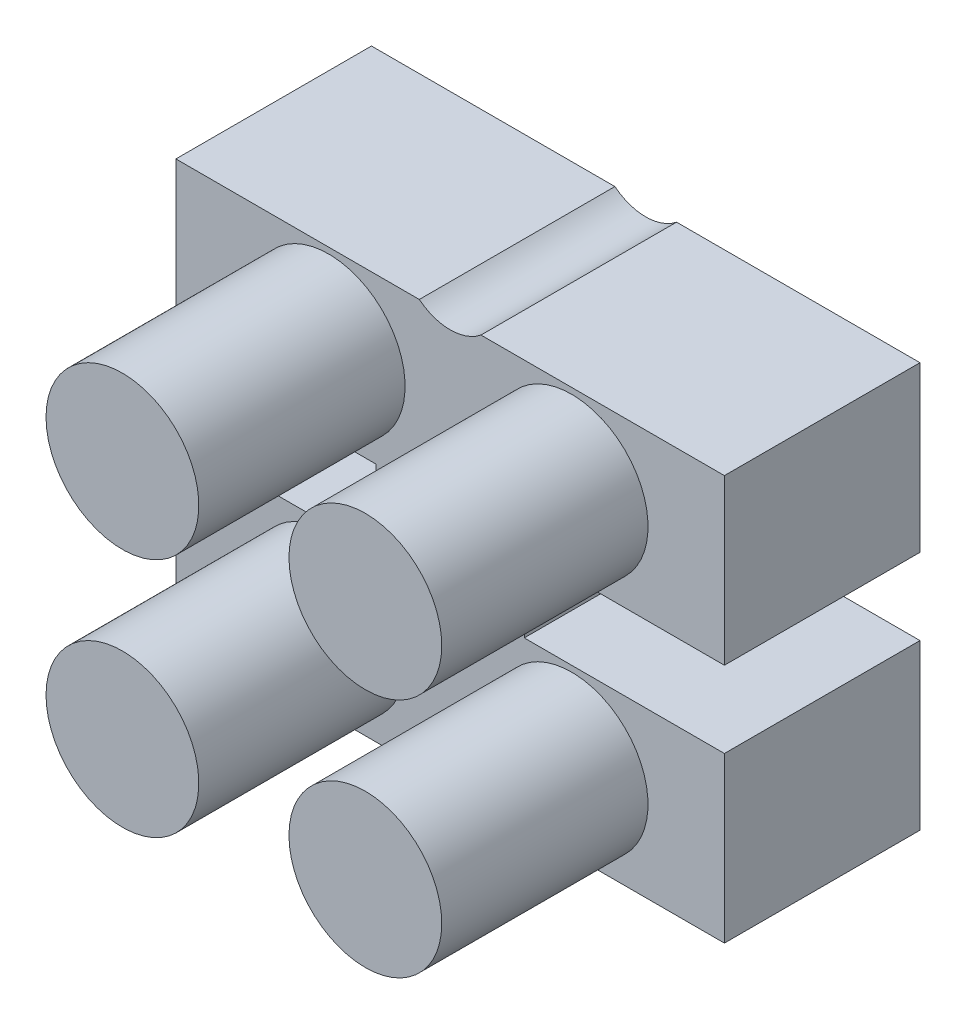
ISO-10303-21;
HEADER;
FILE_DESCRIPTION(('STEP AP214'),'2;1');
FILE_NAME('part.step','',(''),(''),'','','');
FILE_SCHEMA(('AUTOMOTIVE_DESIGN { 1 0 10303 214 1 1 1 1 }'));
ENDSEC;
DATA;
#1=APPLICATION_CONTEXT('core data for automotive mechanical design processes');
#2=APPLICATION_PROTOCOL_DEFINITION('international standard','automotive_design',2000,#1);
#3=PRODUCT_CONTEXT('',#1,'mechanical');
#4=PRODUCT('Part','Part','',(#3));
#5=PRODUCT_RELATED_PRODUCT_CATEGORY('part','',(#4));
#6=PRODUCT_DEFINITION_FORMATION('','',#4);
#7=PRODUCT_DEFINITION_CONTEXT('part definition',#1,'design');
#8=PRODUCT_DEFINITION('design','',#6,#7);
#9=PRODUCT_DEFINITION_SHAPE('','',#8);
#10=(LENGTH_UNIT() NAMED_UNIT(*) SI_UNIT(.MILLI.,.METRE.));
#11=(NAMED_UNIT(*) PLANE_ANGLE_UNIT() SI_UNIT($,.RADIAN.));
#12=(NAMED_UNIT(*) SI_UNIT($,.STERADIAN.) SOLID_ANGLE_UNIT());
#13=UNCERTAINTY_MEASURE_WITH_UNIT(LENGTH_MEASURE(1.E-05),#10,'distance_accuracy_value','');
#14=(GEOMETRIC_REPRESENTATION_CONTEXT(3) GLOBAL_UNCERTAINTY_ASSIGNED_CONTEXT((#13)) GLOBAL_UNIT_ASSIGNED_CONTEXT((#10,
#11,#12)) REPRESENTATION_CONTEXT('',''));
#15=CARTESIAN_POINT('',(0.,0.,0.));
#16=DIRECTION('',(0.,0.,1.));
#17=DIRECTION('',(1.,0.,0.));
#18=AXIS2_PLACEMENT_3D('',#15,#16,#17);
#19=CARTESIAN_POINT('',(0.,0.,6.5024));
#20=DIRECTION('',(0.,0.,-1.));
#21=DIRECTION('',(-1.,0.,0.));
#22=AXIS2_PLACEMENT_3D('',#19,#20,#21);
#23=PLANE('',#22);
#24=CARTESIAN_POINT('',(-4.0386,11.99515,6.5024));
#25=DIRECTION('',(0.,0.,-1.));
#26=DIRECTION('',(-1.,0.,0.));
#27=AXIS2_PLACEMENT_3D('',#24,#25,#26);
#28=CIRCLE('',#27,2.54);
#29=CARTESIAN_POINT('',(-6.5786,11.99515,6.5024));
#30=VERTEX_POINT('',#29);
#31=EDGE_CURVE('E269',#30,#30,#28,.T.);
#32=ORIENTED_EDGE('',*,*,#31,.T.);
#33=EDGE_LOOP('',(#32));
#34=FACE_BOUND('',#33,.T.);
#35=CARTESIAN_POINT('',(0.,16.002,6.5024));
#36=DIRECTION('',(0.,0.,1.));
#37=DIRECTION('',(1.,0.,0.));
#38=AXIS2_PLACEMENT_3D('',#35,#36,#37);
#39=CIRCLE('',#38,1.63194999999999);
#40=CARTESIAN_POINT('',(1.63194999999999,16.002,6.5024));
#41=VERTEX_POINT('',#40);
#42=EDGE_CURVE('E306',#41,#41,#39,.T.);
#43=ORIENTED_EDGE('',*,*,#42,.F.);
#44=EDGE_LOOP('',(#43));
#45=FACE_BOUND('',#44,.T.);
#46=CARTESIAN_POINT('',(4.0386,19.99615,6.5024));
#47=DIRECTION('',(0.,0.,-1.));
#48=DIRECTION('',(-1.,0.,0.));
#49=AXIS2_PLACEMENT_3D('',#46,#47,#48);
#50=CIRCLE('',#49,2.54);
#51=CARTESIAN_POINT('',(1.49859999999999,19.99615,6.5024));
#52=VERTEX_POINT('',#51);
#53=EDGE_CURVE('E11',#52,#52,#50,.F.);
#54=ORIENTED_EDGE('',*,*,#53,.F.);
#55=EDGE_LOOP('',(#54));
#56=FACE_BOUND('',#55,.T.);
#57=CARTESIAN_POINT('',(4.0386,11.99515,6.5024));
#58=DIRECTION('',(0.,0.,-1.));
#59=DIRECTION('',(-1.,0.,0.));
#60=AXIS2_PLACEMENT_3D('',#57,#58,#59);
#61=CIRCLE('',#60,2.54);
#62=CARTESIAN_POINT('',(1.49859999999999,11.99515,6.5024));
#63=VERTEX_POINT('',#62);
#64=EDGE_CURVE('E42',#63,#63,#61,.F.);
#65=ORIENTED_EDGE('',*,*,#64,.F.);
#66=EDGE_LOOP('',(#65));
#67=FACE_BOUND('',#66,.T.);
#68=CARTESIAN_POINT('',(-4.0386,19.99615,6.5024));
#69=DIRECTION('',(0.,0.,-1.));
#70=DIRECTION('',(-1.,0.,0.));
#71=AXIS2_PLACEMENT_3D('',#68,#69,#70);
#72=CIRCLE('',#71,2.54);
#73=CARTESIAN_POINT('',(-6.5786,19.99615,6.5024));
#74=VERTEX_POINT('',#73);
#75=EDGE_CURVE('E238',#74,#74,#72,.T.);
#76=ORIENTED_EDGE('',*,*,#75,.T.);
#77=EDGE_LOOP('',(#76));
#78=FACE_BOUND('',#77,.T.);
#79=CARTESIAN_POINT('',(0.,8.001,6.5024));
#80=DIRECTION('',(0.,0.,1.));
#81=DIRECTION('',(1.,0.,0.));
#82=AXIS2_PLACEMENT_3D('',#79,#80,#81);
#83=CIRCLE('',#82,1.63194999999999);
#84=CARTESIAN_POINT('',(1.02487111506763,9.271,6.5024));
#85=VERTEX_POINT('',#84);
#86=CARTESIAN_POINT('',(-1.02487111506763,9.271,6.5024));
#87=VERTEX_POINT('',#86);
#88=EDGE_CURVE('E171',#85,#87,#83,.T.);
#89=ORIENTED_EDGE('',*,*,#88,.F.);
#90=DIRECTION('',(-1.,0.,0.));
#91=VECTOR('',#90,1.);
#92=CARTESIAN_POINT('',(9.1186,9.271,6.5024));
#93=LINE('',#92,#91);
#94=CARTESIAN_POINT('',(9.1186,9.271,6.5024));
#95=VERTEX_POINT('',#94);
#96=EDGE_CURVE('E49',#95,#85,#93,.T.);
#97=ORIENTED_EDGE('',*,*,#96,.F.);
#98=DIRECTION('',(0.,1.,0.));
#99=VECTOR('',#98,1.);
#100=CARTESIAN_POINT('',(9.1186,1.2573,6.5024));
#101=LINE('',#100,#99);
#102=CARTESIAN_POINT('',(9.1186,14.732,6.5024));
#103=VERTEX_POINT('',#102);
#104=EDGE_CURVE('E219',#95,#103,#101,.T.);
#105=ORIENTED_EDGE('',*,*,#104,.T.);
#106=DIRECTION('',(1.,0.,0.));
#107=VECTOR('',#106,1.);
#108=CARTESIAN_POINT('',(9.1186,14.732,6.5024));
#109=LINE('',#108,#107);
#110=CARTESIAN_POINT('',(2.4638,14.732,6.5024));
#111=VERTEX_POINT('',#110);
#112=EDGE_CURVE('E193',#111,#103,#109,.T.);
#113=ORIENTED_EDGE('',*,*,#112,.F.);
#114=DIRECTION('',(0.,-1.,0.));
#115=VECTOR('',#114,1.);
#116=CARTESIAN_POINT('',(2.4638,17.272,6.5024));
#117=LINE('',#116,#115);
#118=CARTESIAN_POINT('',(2.4638,17.272,6.5024));
#119=VERTEX_POINT('',#118);
#120=EDGE_CURVE('E201',#119,#111,#117,.T.);
#121=ORIENTED_EDGE('',*,*,#120,.F.);
#122=DIRECTION('',(-1.,0.,0.));
#123=VECTOR('',#122,1.);
#124=CARTESIAN_POINT('',(9.1186,17.272,6.5024));
#125=LINE('',#124,#123);
#126=CARTESIAN_POINT('',(9.1186,17.272,6.5024));
#127=VERTEX_POINT('',#126);
#128=EDGE_CURVE('E188',#127,#119,#125,.T.);
#129=ORIENTED_EDGE('',*,*,#128,.F.);
#130=CARTESIAN_POINT('',(9.1186,22.733,6.5024));
#131=VERTEX_POINT('',#130);
#132=EDGE_CURVE('E216',#127,#131,#101,.T.);
#133=ORIENTED_EDGE('',*,*,#132,.T.);
#134=DIRECTION('',(1.,0.,0.));
#135=VECTOR('',#134,1.);
#136=CARTESIAN_POINT('',(9.1186,22.733,6.5024));
#137=LINE('',#136,#135);
#138=CARTESIAN_POINT('',(1.02487111506764,22.733,6.5024));
#139=VERTEX_POINT('',#138);
#140=EDGE_CURVE('E182',#139,#131,#137,.T.);
#141=ORIENTED_EDGE('',*,*,#140,.F.);
#142=CARTESIAN_POINT('',(0.,24.003,6.5024));
#143=DIRECTION('',(0.,0.,1.));
#144=DIRECTION('',(1.,0.,0.));
#145=AXIS2_PLACEMENT_3D('',#142,#143,#144);
#146=CIRCLE('',#145,1.63194999999999);
#147=CARTESIAN_POINT('',(-1.02487111506764,22.733,6.5024));
#148=VERTEX_POINT('',#147);
#149=EDGE_CURVE('E300',#148,#139,#146,.T.);
#150=ORIENTED_EDGE('',*,*,#149,.F.);
#151=DIRECTION('',(-1.,0.,0.));
#152=VECTOR('',#151,1.);
#153=CARTESIAN_POINT('',(-9.1186,22.733,6.5024));
#154=LINE('',#153,#152);
#155=CARTESIAN_POINT('',(-9.1186,22.733,6.5024));
#156=VERTEX_POINT('',#155);
#157=EDGE_CURVE('E261',#148,#156,#154,.T.);
#158=ORIENTED_EDGE('',*,*,#157,.T.);
#159=DIRECTION('',(0.,-1.,0.));
#160=VECTOR('',#159,1.);
#161=CARTESIAN_POINT('',(-9.1186,1.2573,6.5024));
#162=LINE('',#161,#160);
#163=CARTESIAN_POINT('',(-9.1186,17.272,6.5024));
#164=VERTEX_POINT('',#163);
#165=EDGE_CURVE('E221',#156,#164,#162,.T.);
#166=ORIENTED_EDGE('',*,*,#165,.T.);
#167=DIRECTION('',(1.,0.,0.));
#168=VECTOR('',#167,1.);
#169=CARTESIAN_POINT('',(-9.1186,17.272,6.5024));
#170=LINE('',#169,#168);
#171=CARTESIAN_POINT('',(-2.4638,17.272,6.5024));
#172=VERTEX_POINT('',#171);
#173=EDGE_CURVE('E279',#164,#172,#170,.T.);
#174=ORIENTED_EDGE('',*,*,#173,.T.);
#175=DIRECTION('',(0.,-1.,0.));
#176=VECTOR('',#175,1.);
#177=CARTESIAN_POINT('',(-2.4638,17.272,6.5024));
#178=LINE('',#177,#176);
#179=CARTESIAN_POINT('',(-2.4638,14.732,6.5024));
#180=VERTEX_POINT('',#179);
#181=EDGE_CURVE('E285',#172,#180,#178,.T.);
#182=ORIENTED_EDGE('',*,*,#181,.T.);
#183=DIRECTION('',(-1.,0.,0.));
#184=VECTOR('',#183,1.);
#185=CARTESIAN_POINT('',(-9.1186,14.732,6.5024));
#186=LINE('',#185,#184);
#187=CARTESIAN_POINT('',(-9.1186,14.732,6.5024));
#188=VERTEX_POINT('',#187);
#189=EDGE_CURVE('E273',#180,#188,#186,.T.);
#190=ORIENTED_EDGE('',*,*,#189,.T.);
#191=CARTESIAN_POINT('',(-9.1186,9.271,6.5024));
#192=VERTEX_POINT('',#191);
#193=EDGE_CURVE('E223',#188,#192,#162,.T.);
#194=ORIENTED_EDGE('',*,*,#193,.T.);
#195=DIRECTION('',(1.,0.,0.));
#196=VECTOR('',#195,1.);
#197=CARTESIAN_POINT('',(-9.1186,9.271,6.5024));
#198=LINE('',#197,#196);
#199=EDGE_CURVE('E242',#192,#87,#198,.T.);
#200=ORIENTED_EDGE('',*,*,#199,.T.);
#201=EDGE_LOOP('',(#89,#97,#105,#113,#121,#129,#133,#141,#150,#158,#166,#174,#182,#190,#194,#200));
#202=FACE_BOUND('',#201,.T.);
#203=ADVANCED_FACE('F34',(#34,#45,#56,#67,#78,#202),#23,.F.);
#204=CARTESIAN_POINT('',(0.,0.,0.));
#205=DIRECTION('',(0.,0.,-1.));
#206=DIRECTION('',(-1.,0.,0.));
#207=AXIS2_PLACEMENT_3D('',#204,#205,#206);
#208=PLANE('',#207);
#209=CARTESIAN_POINT('',(0.,16.002,0.));
#210=DIRECTION('',(0.,0.,1.));
#211=DIRECTION('',(1.,0.,0.));
#212=AXIS2_PLACEMENT_3D('',#209,#210,#211);
#213=CIRCLE('',#212,1.63195);
#214=CARTESIAN_POINT('',(1.63195,16.002,0.));
#215=VERTEX_POINT('',#214);
#216=EDGE_CURVE('E176',#215,#215,#213,.T.);
#217=ORIENTED_EDGE('',*,*,#216,.T.);
#218=EDGE_LOOP('',(#217));
#219=FACE_BOUND('',#218,.T.);
#220=DIRECTION('',(-1.,0.,0.));
#221=VECTOR('',#220,1.);
#222=CARTESIAN_POINT('',(9.1186,9.271,0.));
#223=LINE('',#222,#221);
#224=CARTESIAN_POINT('',(9.1186,9.271,0.));
#225=VERTEX_POINT('',#224);
#226=CARTESIAN_POINT('',(1.02487111506763,9.271,0.));
#227=VERTEX_POINT('',#226);
#228=EDGE_CURVE('E149',#225,#227,#223,.T.);
#229=ORIENTED_EDGE('',*,*,#228,.T.);
#230=CARTESIAN_POINT('',(0.,8.001,0.));
#231=DIRECTION('',(0.,0.,1.));
#232=DIRECTION('',(1.,0.,0.));
#233=AXIS2_PLACEMENT_3D('',#230,#231,#232);
#234=CIRCLE('',#233,1.63195);
#235=CARTESIAN_POINT('',(-1.02487111506763,9.271,0.));
#236=VERTEX_POINT('',#235);
#237=EDGE_CURVE('E152',#227,#236,#234,.T.);
#238=ORIENTED_EDGE('',*,*,#237,.T.);
#239=DIRECTION('',(1.,0.,0.));
#240=VECTOR('',#239,1.);
#241=CARTESIAN_POINT('',(-9.1186,9.271,0.));
#242=LINE('',#241,#240);
#243=CARTESIAN_POINT('',(-9.1186,9.271,0.));
#244=VERTEX_POINT('',#243);
#245=EDGE_CURVE('E248',#244,#236,#242,.T.);
#246=ORIENTED_EDGE('',*,*,#245,.F.);
#247=DIRECTION('',(0.,-1.,0.));
#248=VECTOR('',#247,1.);
#249=CARTESIAN_POINT('',(-9.1186,1.2573,0.));
#250=LINE('',#249,#248);
#251=CARTESIAN_POINT('',(-9.1186,14.732,0.));
#252=VERTEX_POINT('',#251);
#253=EDGE_CURVE('E226',#252,#244,#250,.T.);
#254=ORIENTED_EDGE('',*,*,#253,.F.);
#255=DIRECTION('',(-1.,0.,0.));
#256=VECTOR('',#255,1.);
#257=CARTESIAN_POINT('',(-9.1186,14.732,0.));
#258=LINE('',#257,#256);
#259=CARTESIAN_POINT('',(-2.4638,14.732,0.));
#260=VERTEX_POINT('',#259);
#261=EDGE_CURVE('E276',#260,#252,#258,.T.);
#262=ORIENTED_EDGE('',*,*,#261,.F.);
#263=DIRECTION('',(0.,-1.,0.));
#264=VECTOR('',#263,1.);
#265=CARTESIAN_POINT('',(-2.4638,17.272,0.));
#266=LINE('',#265,#264);
#267=CARTESIAN_POINT('',(-2.4638,17.272,0.));
#268=VERTEX_POINT('',#267);
#269=EDGE_CURVE('E278',#268,#260,#266,.T.);
#270=ORIENTED_EDGE('',*,*,#269,.F.);
#271=DIRECTION('',(1.,0.,0.));
#272=VECTOR('',#271,1.);
#273=CARTESIAN_POINT('',(-9.1186,17.272,0.));
#274=LINE('',#273,#272);
#275=CARTESIAN_POINT('',(-9.1186,17.272,0.));
#276=VERTEX_POINT('',#275);
#277=EDGE_CURVE('E281',#276,#268,#274,.T.);
#278=ORIENTED_EDGE('',*,*,#277,.F.);
#279=CARTESIAN_POINT('',(-9.1186,22.733,0.));
#280=VERTEX_POINT('',#279);
#281=EDGE_CURVE('E220',#280,#276,#250,.T.);
#282=ORIENTED_EDGE('',*,*,#281,.F.);
#283=DIRECTION('',(-1.,0.,0.));
#284=VECTOR('',#283,1.);
#285=CARTESIAN_POINT('',(-9.1186,22.733,0.));
#286=LINE('',#285,#284);
#287=CARTESIAN_POINT('',(-1.02487111506764,22.733,0.));
#288=VERTEX_POINT('',#287);
#289=EDGE_CURVE('E263',#288,#280,#286,.T.);
#290=ORIENTED_EDGE('',*,*,#289,.F.);
#291=CARTESIAN_POINT('',(0.,24.003,0.));
#292=DIRECTION('',(0.,0.,1.));
#293=DIRECTION('',(1.,0.,0.));
#294=AXIS2_PLACEMENT_3D('',#291,#292,#293);
#295=CIRCLE('',#294,1.63195);
#296=CARTESIAN_POINT('',(1.02487111506764,22.733,0.));
#297=VERTEX_POINT('',#296);
#298=EDGE_CURVE('E303',#288,#297,#295,.T.);
#299=ORIENTED_EDGE('',*,*,#298,.T.);
#300=DIRECTION('',(1.,0.,0.));
#301=VECTOR('',#300,1.);
#302=CARTESIAN_POINT('',(9.1186,22.733,0.));
#303=LINE('',#302,#301);
#304=CARTESIAN_POINT('',(9.1186,22.733,0.));
#305=VERTEX_POINT('',#304);
#306=EDGE_CURVE('E57',#297,#305,#303,.T.);
#307=ORIENTED_EDGE('',*,*,#306,.T.);
#308=DIRECTION('',(0.,1.,0.));
#309=VECTOR('',#308,1.);
#310=CARTESIAN_POINT('',(9.1186,1.2573,0.));
#311=LINE('',#310,#309);
#312=CARTESIAN_POINT('',(9.1186,17.272,0.));
#313=VERTEX_POINT('',#312);
#314=EDGE_CURVE('E215',#313,#305,#311,.T.);
#315=ORIENTED_EDGE('',*,*,#314,.F.);
#316=DIRECTION('',(-1.,0.,0.));
#317=VECTOR('',#316,1.);
#318=CARTESIAN_POINT('',(9.1186,17.272,0.));
#319=LINE('',#318,#317);
#320=CARTESIAN_POINT('',(2.4638,17.272,0.));
#321=VERTEX_POINT('',#320);
#322=EDGE_CURVE('E189',#313,#321,#319,.T.);
#323=ORIENTED_EDGE('',*,*,#322,.T.);
#324=DIRECTION('',(0.,-1.,0.));
#325=VECTOR('',#324,1.);
#326=CARTESIAN_POINT('',(2.4638,17.272,0.));
#327=LINE('',#326,#325);
#328=CARTESIAN_POINT('',(2.4638,14.732,0.));
#329=VERTEX_POINT('',#328);
#330=EDGE_CURVE('E192',#321,#329,#327,.T.);
#331=ORIENTED_EDGE('',*,*,#330,.T.);
#332=DIRECTION('',(1.,0.,0.));
#333=VECTOR('',#332,1.);
#334=CARTESIAN_POINT('',(9.1186,14.732,0.));
#335=LINE('',#334,#333);
#336=CARTESIAN_POINT('',(9.1186,14.732,0.));
#337=VERTEX_POINT('',#336);
#338=EDGE_CURVE('E196',#329,#337,#335,.T.);
#339=ORIENTED_EDGE('',*,*,#338,.T.);
#340=EDGE_CURVE('E155',#225,#337,#311,.T.);
#341=ORIENTED_EDGE('',*,*,#340,.F.);
#342=EDGE_LOOP('',(#229,#238,#246,#254,#262,#270,#278,#282,#290,#299,#307,#315,#323,#331,#339,#341));
#343=FACE_BOUND('',#342,.T.);
#344=ADVANCED_FACE('F36',(#219,#343),#208,.T.);
#345=CARTESIAN_POINT('',(0.,8.001,6.5024));
#346=DIRECTION('',(0.,0.,1.));
#347=DIRECTION('',(1.,0.,0.));
#348=AXIS2_PLACEMENT_3D('',#345,#346,#347);
#349=CYLINDRICAL_SURFACE('',#348,1.63194999999999);
#350=DIRECTION('',(0.,0.,1.));
#351=VECTOR('',#350,1.);
#352=CARTESIAN_POINT('',(1.02487111506763,9.271,6.5024));
#353=LINE('',#352,#351);
#354=EDGE_CURVE('E159',#85,#227,#353,.F.);
#355=ORIENTED_EDGE('',*,*,#354,.F.);
#356=ORIENTED_EDGE('',*,*,#88,.T.);
#357=DIRECTION('',(0.,0.,1.));
#358=VECTOR('',#357,1.);
#359=CARTESIAN_POINT('',(-1.02487111506763,9.271,6.5024));
#360=LINE('',#359,#358);
#361=EDGE_CURVE('E165',#236,#87,#360,.T.);
#362=ORIENTED_EDGE('',*,*,#361,.F.);
#363=ORIENTED_EDGE('',*,*,#237,.F.);
#364=EDGE_LOOP('',(#355,#356,#362,#363));
#365=FACE_BOUND('',#364,.T.);
#366=ADVANCED_FACE('F168',(#365),#349,.F.);
#367=CARTESIAN_POINT('',(-9.1186,1.2573,6.5024));
#368=DIRECTION('',(1.,0.,0.));
#369=DIRECTION('',(0.,0.,-1.));
#370=AXIS2_PLACEMENT_3D('',#367,#368,#369);
#371=PLANE('',#370);
#372=DIRECTION('',(0.,0.,1.));
#373=VECTOR('',#372,1.);
#374=CARTESIAN_POINT('',(-9.1186,22.733,0.));
#375=LINE('',#374,#373);
#376=EDGE_CURVE('E265',#280,#156,#375,.T.);
#377=ORIENTED_EDGE('',*,*,#376,.F.);
#378=ORIENTED_EDGE('',*,*,#281,.T.);
#379=DIRECTION('',(0.,0.,1.));
#380=VECTOR('',#379,1.);
#381=CARTESIAN_POINT('',(-9.1186,17.272,0.));
#382=LINE('',#381,#380);
#383=EDGE_CURVE('E249',#276,#164,#382,.T.);
#384=ORIENTED_EDGE('',*,*,#383,.T.);
#385=ORIENTED_EDGE('',*,*,#165,.F.);
#386=EDGE_LOOP('',(#377,#378,#384,#385));
#387=FACE_BOUND('',#386,.T.);
#388=ADVANCED_FACE('F360',(#387),#371,.F.);
#389=DIRECTION('',(0.,0.,1.));
#390=VECTOR('',#389,1.);
#391=CARTESIAN_POINT('',(-9.1186,14.732,0.));
#392=LINE('',#391,#390);
#393=EDGE_CURVE('E283',#252,#188,#392,.T.);
#394=ORIENTED_EDGE('',*,*,#393,.F.);
#395=ORIENTED_EDGE('',*,*,#253,.T.);
#396=DIRECTION('',(0.,0.,1.));
#397=VECTOR('',#396,1.);
#398=CARTESIAN_POINT('',(-9.1186,9.271,0.));
#399=LINE('',#398,#397);
#400=EDGE_CURVE('E297',#244,#192,#399,.T.);
#401=ORIENTED_EDGE('',*,*,#400,.T.);
#402=ORIENTED_EDGE('',*,*,#193,.F.);
#403=EDGE_LOOP('',(#394,#395,#401,#402));
#404=FACE_BOUND('',#403,.T.);
#405=ADVANCED_FACE('F363',(#404),#371,.F.);
#406=CARTESIAN_POINT('',(9.1186,1.2573,6.5024));
#407=DIRECTION('',(-1.,0.,0.));
#408=DIRECTION('',(0.,0.,1.));
#409=AXIS2_PLACEMENT_3D('',#406,#407,#408);
#410=PLANE('',#409);
#411=ORIENTED_EDGE('',*,*,#314,.T.);
#412=DIRECTION('',(0.,0.,1.));
#413=VECTOR('',#412,1.);
#414=CARTESIAN_POINT('',(9.1186,22.733,0.));
#415=LINE('',#414,#413);
#416=EDGE_CURVE('E184',#305,#131,#415,.T.);
#417=ORIENTED_EDGE('',*,*,#416,.T.);
#418=ORIENTED_EDGE('',*,*,#132,.F.);
#419=DIRECTION('',(0.,0.,1.));
#420=VECTOR('',#419,1.);
#421=CARTESIAN_POINT('',(9.1186,17.272,0.));
#422=LINE('',#421,#420);
#423=EDGE_CURVE('E198',#313,#127,#422,.T.);
#424=ORIENTED_EDGE('',*,*,#423,.F.);
#425=EDGE_LOOP('',(#411,#417,#418,#424));
#426=FACE_BOUND('',#425,.T.);
#427=ADVANCED_FACE('F365',(#426),#410,.F.);
#428=ORIENTED_EDGE('',*,*,#340,.T.);
#429=DIRECTION('',(0.,0.,1.));
#430=VECTOR('',#429,1.);
#431=CARTESIAN_POINT('',(9.1186,14.732,0.));
#432=LINE('',#431,#430);
#433=EDGE_CURVE('E205',#337,#103,#432,.T.);
#434=ORIENTED_EDGE('',*,*,#433,.T.);
#435=ORIENTED_EDGE('',*,*,#104,.F.);
#436=DIRECTION('',(0.,0.,1.));
#437=VECTOR('',#436,1.);
#438=CARTESIAN_POINT('',(9.1186,9.271,0.));
#439=LINE('',#438,#437);
#440=EDGE_CURVE('E157',#225,#95,#439,.T.);
#441=ORIENTED_EDGE('',*,*,#440,.F.);
#442=EDGE_LOOP('',(#428,#434,#435,#441));
#443=FACE_BOUND('',#442,.T.);
#444=ADVANCED_FACE('F359',(#443),#410,.F.);
#445=CARTESIAN_POINT('',(9.1186,9.271,0.));
#446=DIRECTION('',(0.,1.,0.));
#447=DIRECTION('',(-1.,0.,0.));
#448=AXIS2_PLACEMENT_3D('',#445,#446,#447);
#449=PLANE('',#448);
#450=ORIENTED_EDGE('',*,*,#96,.T.);
#451=ORIENTED_EDGE('',*,*,#354,.T.);
#452=ORIENTED_EDGE('',*,*,#228,.F.);
#453=ORIENTED_EDGE('',*,*,#440,.T.);
#454=EDGE_LOOP('',(#450,#451,#452,#453));
#455=FACE_BOUND('',#454,.T.);
#456=ADVANCED_FACE('F160',(#455),#449,.F.);
#457=CARTESIAN_POINT('',(9.1186,14.732,0.));
#458=DIRECTION('',(0.,-1.,0.));
#459=DIRECTION('',(1.,0.,0.));
#460=AXIS2_PLACEMENT_3D('',#457,#458,#459);
#461=PLANE('',#460);
#462=ORIENTED_EDGE('',*,*,#112,.T.);
#463=ORIENTED_EDGE('',*,*,#433,.F.);
#464=ORIENTED_EDGE('',*,*,#338,.F.);
#465=DIRECTION('',(0.,0.,1.));
#466=VECTOR('',#465,1.);
#467=CARTESIAN_POINT('',(2.4638,14.732,0.));
#468=LINE('',#467,#466);
#469=EDGE_CURVE('E208',#329,#111,#468,.T.);
#470=ORIENTED_EDGE('',*,*,#469,.T.);
#471=EDGE_LOOP('',(#462,#463,#464,#470));
#472=FACE_BOUND('',#471,.T.);
#473=ADVANCED_FACE('F346',(#472),#461,.F.);
#474=CARTESIAN_POINT('',(2.4638,17.272,0.));
#475=DIRECTION('',(-1.,0.,0.));
#476=DIRECTION('',(0.,-1.,0.));
#477=AXIS2_PLACEMENT_3D('',#474,#475,#476);
#478=PLANE('',#477);
#479=ORIENTED_EDGE('',*,*,#120,.T.);
#480=ORIENTED_EDGE('',*,*,#469,.F.);
#481=ORIENTED_EDGE('',*,*,#330,.F.);
#482=DIRECTION('',(0.,0.,1.));
#483=VECTOR('',#482,1.);
#484=CARTESIAN_POINT('',(2.4638,17.272,0.));
#485=LINE('',#484,#483);
#486=EDGE_CURVE('E210',#321,#119,#485,.T.);
#487=ORIENTED_EDGE('',*,*,#486,.T.);
#488=EDGE_LOOP('',(#479,#480,#481,#487));
#489=FACE_BOUND('',#488,.T.);
#490=ADVANCED_FACE('F349',(#489),#478,.F.);
#491=CARTESIAN_POINT('',(9.1186,17.272,0.));
#492=DIRECTION('',(0.,1.,0.));
#493=DIRECTION('',(-1.,0.,0.));
#494=AXIS2_PLACEMENT_3D('',#491,#492,#493);
#495=PLANE('',#494);
#496=ORIENTED_EDGE('',*,*,#128,.T.);
#497=ORIENTED_EDGE('',*,*,#486,.F.);
#498=ORIENTED_EDGE('',*,*,#322,.F.);
#499=ORIENTED_EDGE('',*,*,#423,.T.);
#500=EDGE_LOOP('',(#496,#497,#498,#499));
#501=FACE_BOUND('',#500,.T.);
#502=ADVANCED_FACE('F345',(#501),#495,.F.);
#503=CARTESIAN_POINT('',(9.1186,22.733,0.));
#504=DIRECTION('',(0.,-1.,0.));
#505=DIRECTION('',(1.,0.,0.));
#506=AXIS2_PLACEMENT_3D('',#503,#504,#505);
#507=PLANE('',#506);
#508=ORIENTED_EDGE('',*,*,#140,.T.);
#509=ORIENTED_EDGE('',*,*,#416,.F.);
#510=ORIENTED_EDGE('',*,*,#306,.F.);
#511=DIRECTION('',(0.,0.,1.));
#512=VECTOR('',#511,1.);
#513=CARTESIAN_POINT('',(1.02487111506764,22.733,6.5024));
#514=LINE('',#513,#512);
#515=EDGE_CURVE('E256',#139,#297,#514,.F.);
#516=ORIENTED_EDGE('',*,*,#515,.F.);
#517=EDGE_LOOP('',(#508,#509,#510,#516));
#518=FACE_BOUND('',#517,.T.);
#519=ADVANCED_FACE('F341',(#518),#507,.F.);
#520=CARTESIAN_POINT('',(4.0386,11.99515,13.3604));
#521=DIRECTION('',(0.,0.,-1.));
#522=DIRECTION('',(-1.,0.,0.));
#523=AXIS2_PLACEMENT_3D('',#520,#521,#522);
#524=CYLINDRICAL_SURFACE('',#523,2.54);
#525=CARTESIAN_POINT('',(4.0386,11.99515,13.3604));
#526=DIRECTION('',(0.,0.,1.));
#527=DIRECTION('',(1.,0.,0.));
#528=AXIS2_PLACEMENT_3D('',#525,#526,#527);
#529=CIRCLE('',#528,2.54);
#530=CARTESIAN_POINT('',(6.5786,11.99515,13.3604));
#531=VERTEX_POINT('',#530);
#532=EDGE_CURVE('E174',#531,#531,#529,.T.);
#533=ORIENTED_EDGE('',*,*,#532,.F.);
#534=EDGE_LOOP('',(#533));
#535=FACE_BOUND('',#534,.T.);
#536=ORIENTED_EDGE('',*,*,#64,.T.);
#537=EDGE_LOOP('',(#536));
#538=FACE_BOUND('',#537,.T.);
#539=ADVANCED_FACE('F230',(#535,#538),#524,.T.);
#540=CARTESIAN_POINT('',(4.0386,11.99515,13.3604));
#541=DIRECTION('',(0.,0.,1.));
#542=DIRECTION('',(1.,0.,0.));
#543=AXIS2_PLACEMENT_3D('',#540,#541,#542);
#544=PLANE('',#543);
#545=ORIENTED_EDGE('',*,*,#532,.T.);
#546=EDGE_LOOP('',(#545));
#547=FACE_BOUND('',#546,.T.);
#548=ADVANCED_FACE('F325',(#547),#544,.T.);
#549=CARTESIAN_POINT('',(4.0386,19.99615,13.3604));
#550=DIRECTION('',(0.,0.,-1.));
#551=DIRECTION('',(-1.,0.,0.));
#552=AXIS2_PLACEMENT_3D('',#549,#550,#551);
#553=CYLINDRICAL_SURFACE('',#552,2.54);
#554=CARTESIAN_POINT('',(4.0386,19.99615,13.3604));
#555=DIRECTION('',(0.,0.,1.));
#556=DIRECTION('',(1.,0.,0.));
#557=AXIS2_PLACEMENT_3D('',#554,#555,#556);
#558=CIRCLE('',#557,2.54);
#559=CARTESIAN_POINT('',(6.5786,19.99615,13.3604));
#560=VERTEX_POINT('',#559);
#561=EDGE_CURVE('E170',#560,#560,#558,.T.);
#562=ORIENTED_EDGE('',*,*,#561,.F.);
#563=EDGE_LOOP('',(#562));
#564=FACE_BOUND('',#563,.T.);
#565=ORIENTED_EDGE('',*,*,#53,.T.);
#566=EDGE_LOOP('',(#565));
#567=FACE_BOUND('',#566,.T.);
#568=ADVANCED_FACE('F323',(#564,#567),#553,.T.);
#569=CARTESIAN_POINT('',(4.0386,19.99615,13.3604));
#570=DIRECTION('',(0.,0.,1.));
#571=DIRECTION('',(1.,0.,0.));
#572=AXIS2_PLACEMENT_3D('',#569,#570,#571);
#573=PLANE('',#572);
#574=ORIENTED_EDGE('',*,*,#561,.T.);
#575=EDGE_LOOP('',(#574));
#576=FACE_BOUND('',#575,.T.);
#577=ADVANCED_FACE('F316',(#576),#573,.T.);
#578=CARTESIAN_POINT('',(0.,16.002,6.5024));
#579=DIRECTION('',(0.,0.,1.));
#580=DIRECTION('',(1.,0.,0.));
#581=AXIS2_PLACEMENT_3D('',#578,#579,#580);
#582=CYLINDRICAL_SURFACE('',#581,1.63194999999999);
#583=ORIENTED_EDGE('',*,*,#216,.F.);
#584=EDGE_LOOP('',(#583));
#585=FACE_BOUND('',#584,.T.);
#586=ORIENTED_EDGE('',*,*,#42,.T.);
#587=EDGE_LOOP('',(#586));
#588=FACE_BOUND('',#587,.T.);
#589=ADVANCED_FACE('F312',(#585,#588),#582,.F.);
#590=CARTESIAN_POINT('',(0.,24.003,6.5024));
#591=DIRECTION('',(0.,0.,1.));
#592=DIRECTION('',(1.,0.,0.));
#593=AXIS2_PLACEMENT_3D('',#590,#591,#592);
#594=CYLINDRICAL_SURFACE('',#593,1.63194999999999);
#595=ORIENTED_EDGE('',*,*,#149,.T.);
#596=ORIENTED_EDGE('',*,*,#515,.T.);
#597=ORIENTED_EDGE('',*,*,#298,.F.);
#598=DIRECTION('',(0.,0.,1.));
#599=VECTOR('',#598,1.);
#600=CARTESIAN_POINT('',(-1.02487111506764,22.733,6.5024));
#601=LINE('',#600,#599);
#602=EDGE_CURVE('E164',#288,#148,#601,.T.);
#603=ORIENTED_EDGE('',*,*,#602,.T.);
#604=EDGE_LOOP('',(#595,#596,#597,#603));
#605=FACE_BOUND('',#604,.T.);
#606=ADVANCED_FACE('F315',(#605),#594,.F.);
#607=CARTESIAN_POINT('',(-9.1186,9.271,0.));
#608=DIRECTION('',(0.,-1.,0.));
#609=DIRECTION('',(1.,0.,0.));
#610=AXIS2_PLACEMENT_3D('',#607,#608,#609);
#611=PLANE('',#610);
#612=ORIENTED_EDGE('',*,*,#199,.F.);
#613=ORIENTED_EDGE('',*,*,#400,.F.);
#614=ORIENTED_EDGE('',*,*,#245,.T.);
#615=ORIENTED_EDGE('',*,*,#361,.T.);
#616=EDGE_LOOP('',(#612,#613,#614,#615));
#617=FACE_BOUND('',#616,.T.);
#618=ADVANCED_FACE('F251',(#617),#611,.T.);
#619=CARTESIAN_POINT('',(-9.1186,17.272,0.));
#620=DIRECTION('',(0.,-1.,0.));
#621=DIRECTION('',(1.,0.,0.));
#622=AXIS2_PLACEMENT_3D('',#619,#620,#621);
#623=PLANE('',#622);
#624=ORIENTED_EDGE('',*,*,#173,.F.);
#625=ORIENTED_EDGE('',*,*,#383,.F.);
#626=ORIENTED_EDGE('',*,*,#277,.T.);
#627=DIRECTION('',(0.,0.,1.));
#628=VECTOR('',#627,1.);
#629=CARTESIAN_POINT('',(-2.4638,17.272,0.));
#630=LINE('',#629,#628);
#631=EDGE_CURVE('E292',#268,#172,#630,.T.);
#632=ORIENTED_EDGE('',*,*,#631,.T.);
#633=EDGE_LOOP('',(#624,#625,#626,#632));
#634=FACE_BOUND('',#633,.T.);
#635=ADVANCED_FACE('F402',(#634),#623,.T.);
#636=CARTESIAN_POINT('',(-2.4638,17.272,0.));
#637=DIRECTION('',(-1.,0.,0.));
#638=DIRECTION('',(0.,-1.,0.));
#639=AXIS2_PLACEMENT_3D('',#636,#637,#638);
#640=PLANE('',#639);
#641=ORIENTED_EDGE('',*,*,#181,.F.);
#642=ORIENTED_EDGE('',*,*,#631,.F.);
#643=ORIENTED_EDGE('',*,*,#269,.T.);
#644=DIRECTION('',(0.,0.,1.));
#645=VECTOR('',#644,1.);
#646=CARTESIAN_POINT('',(-2.4638,14.732,0.));
#647=LINE('',#646,#645);
#648=EDGE_CURVE('E294',#260,#180,#647,.T.);
#649=ORIENTED_EDGE('',*,*,#648,.T.);
#650=EDGE_LOOP('',(#641,#642,#643,#649));
#651=FACE_BOUND('',#650,.T.);
#652=ADVANCED_FACE('F398',(#651),#640,.T.);
#653=CARTESIAN_POINT('',(-9.1186,14.732,0.));
#654=DIRECTION('',(0.,1.,0.));
#655=DIRECTION('',(-1.,0.,0.));
#656=AXIS2_PLACEMENT_3D('',#653,#654,#655);
#657=PLANE('',#656);
#658=ORIENTED_EDGE('',*,*,#189,.F.);
#659=ORIENTED_EDGE('',*,*,#648,.F.);
#660=ORIENTED_EDGE('',*,*,#261,.T.);
#661=ORIENTED_EDGE('',*,*,#393,.T.);
#662=EDGE_LOOP('',(#658,#659,#660,#661));
#663=FACE_BOUND('',#662,.T.);
#664=ADVANCED_FACE('F395',(#663),#657,.T.);
#665=CARTESIAN_POINT('',(-4.0386,11.99515,13.3604));
#666=DIRECTION('',(0.,0.,-1.));
#667=DIRECTION('',(-1.,0.,0.));
#668=AXIS2_PLACEMENT_3D('',#665,#666,#667);
#669=CYLINDRICAL_SURFACE('',#668,2.54);
#670=CARTESIAN_POINT('',(-4.0386,11.99515,13.3604));
#671=DIRECTION('',(0.,0.,-1.));
#672=DIRECTION('',(-1.,0.,0.));
#673=AXIS2_PLACEMENT_3D('',#670,#671,#672);
#674=CIRCLE('',#673,2.54);
#675=CARTESIAN_POINT('',(-6.5786,11.99515,13.3604));
#676=VERTEX_POINT('',#675);
#677=EDGE_CURVE('E270',#676,#676,#674,.T.);
#678=ORIENTED_EDGE('',*,*,#677,.T.);
#679=EDGE_LOOP('',(#678));
#680=FACE_BOUND('',#679,.T.);
#681=ORIENTED_EDGE('',*,*,#31,.F.);
#682=EDGE_LOOP('',(#681));
#683=FACE_BOUND('',#682,.T.);
#684=ADVANCED_FACE('F419',(#680,#683),#669,.T.);
#685=CARTESIAN_POINT('',(-4.0386,11.99515,13.3604));
#686=DIRECTION('',(0.,0.,1.));
#687=DIRECTION('',(-1.,0.,0.));
#688=AXIS2_PLACEMENT_3D('',#685,#686,#687);
#689=PLANE('',#688);
#690=ORIENTED_EDGE('',*,*,#677,.F.);
#691=EDGE_LOOP('',(#690));
#692=FACE_BOUND('',#691,.T.);
#693=ADVANCED_FACE('F410',(#692),#689,.T.);
#694=CARTESIAN_POINT('',(-9.1186,22.733,0.));
#695=DIRECTION('',(0.,1.,0.));
#696=DIRECTION('',(-1.,0.,0.));
#697=AXIS2_PLACEMENT_3D('',#694,#695,#696);
#698=PLANE('',#697);
#699=ORIENTED_EDGE('',*,*,#157,.F.);
#700=ORIENTED_EDGE('',*,*,#602,.F.);
#701=ORIENTED_EDGE('',*,*,#289,.T.);
#702=ORIENTED_EDGE('',*,*,#376,.T.);
#703=EDGE_LOOP('',(#699,#700,#701,#702));
#704=FACE_BOUND('',#703,.T.);
#705=ADVANCED_FACE('F407',(#704),#698,.T.);
#706=CARTESIAN_POINT('',(-4.0386,19.99615,13.3604));
#707=DIRECTION('',(0.,0.,-1.));
#708=DIRECTION('',(-1.,0.,0.));
#709=AXIS2_PLACEMENT_3D('',#706,#707,#708);
#710=CYLINDRICAL_SURFACE('',#709,2.54);
#711=CARTESIAN_POINT('',(-4.0386,19.99615,13.3604));
#712=DIRECTION('',(0.,0.,-1.));
#713=DIRECTION('',(-1.,0.,0.));
#714=AXIS2_PLACEMENT_3D('',#711,#712,#713);
#715=CIRCLE('',#714,2.54);
#716=CARTESIAN_POINT('',(-6.5786,19.99615,13.3604));
#717=VERTEX_POINT('',#716);
#718=EDGE_CURVE('E258',#717,#717,#715,.T.);
#719=ORIENTED_EDGE('',*,*,#718,.T.);
#720=EDGE_LOOP('',(#719));
#721=FACE_BOUND('',#720,.T.);
#722=ORIENTED_EDGE('',*,*,#75,.F.);
#723=EDGE_LOOP('',(#722));
#724=FACE_BOUND('',#723,.T.);
#725=ADVANCED_FACE('F409',(#721,#724),#710,.T.);
#726=CARTESIAN_POINT('',(-4.0386,19.99615,13.3604));
#727=DIRECTION('',(0.,0.,1.));
#728=DIRECTION('',(-1.,0.,0.));
#729=AXIS2_PLACEMENT_3D('',#726,#727,#728);
#730=PLANE('',#729);
#731=ORIENTED_EDGE('',*,*,#718,.F.);
#732=EDGE_LOOP('',(#731));
#733=FACE_BOUND('',#732,.T.);
#734=ADVANCED_FACE('F416',(#733),#730,.T.);
#735=CLOSED_SHELL('',(#203,#344,#366,#388,#405,#427,#444,#456,#473,#490,#502,#519,#539,#548,
#568,#577,#589,#606,#618,#635,#652,#664,#684,#693,#705,#725,#734));
#736=MANIFOLD_SOLID_BREP('B2',#735);
#737=ADVANCED_BREP_SHAPE_REPRESENTATION('',(#18,#736),#14);
#738=SHAPE_DEFINITION_REPRESENTATION(#9,#737);
ENDSEC;
END-ISO-10303-21;
